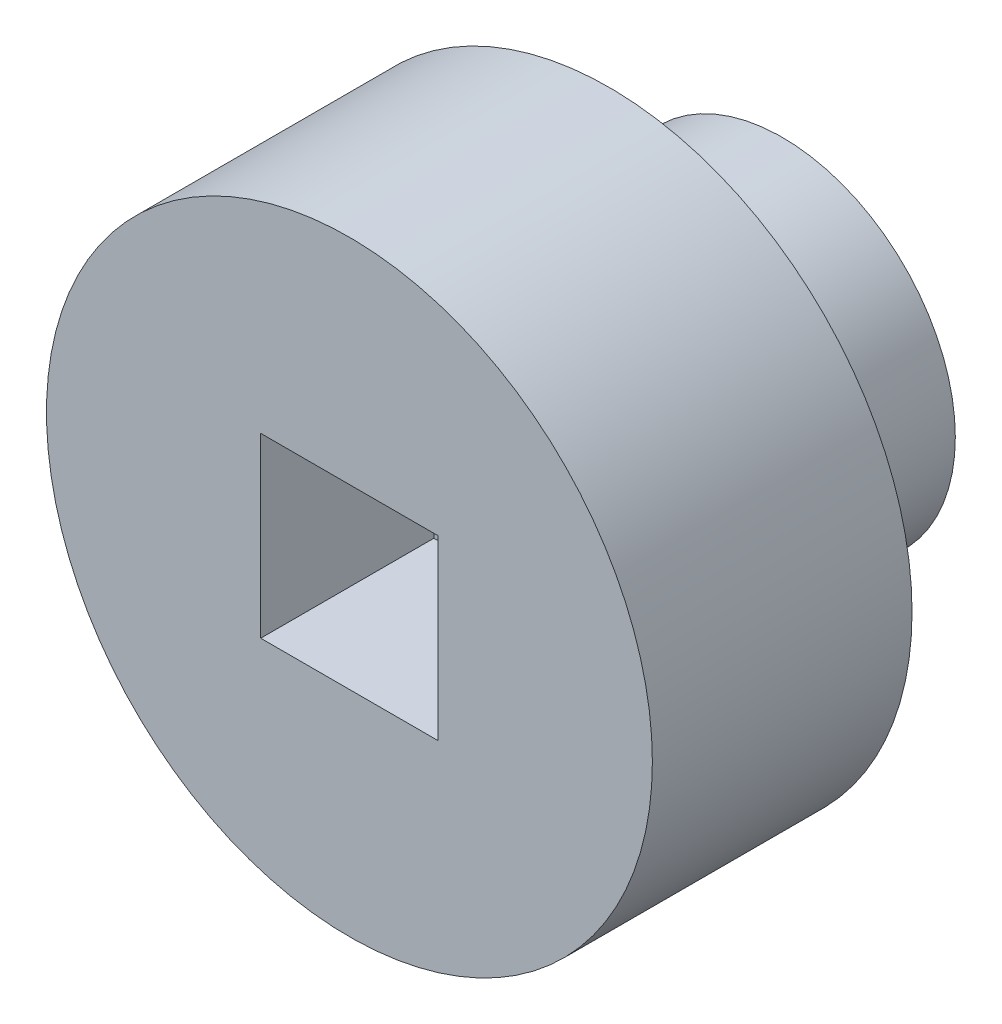
ISO-10303-21;
HEADER;
FILE_DESCRIPTION(('STEP AP214'),'2;1');
FILE_NAME('part.step','',(''),(''),'','','');
FILE_SCHEMA(('AUTOMOTIVE_DESIGN { 1 0 10303 214 1 1 1 1 }'));
ENDSEC;
DATA;
#1=APPLICATION_CONTEXT('core data for automotive mechanical design processes');
#2=APPLICATION_PROTOCOL_DEFINITION('international standard','automotive_design',2000,#1);
#3=PRODUCT_CONTEXT('',#1,'mechanical');
#4=PRODUCT('Part','Part','',(#3));
#5=PRODUCT_RELATED_PRODUCT_CATEGORY('part','',(#4));
#6=PRODUCT_DEFINITION_FORMATION('','',#4);
#7=PRODUCT_DEFINITION_CONTEXT('part definition',#1,'design');
#8=PRODUCT_DEFINITION('design','',#6,#7);
#9=PRODUCT_DEFINITION_SHAPE('','',#8);
#10=(LENGTH_UNIT() NAMED_UNIT(*) SI_UNIT(.MILLI.,.METRE.));
#11=(NAMED_UNIT(*) PLANE_ANGLE_UNIT() SI_UNIT($,.RADIAN.));
#12=(NAMED_UNIT(*) SI_UNIT($,.STERADIAN.) SOLID_ANGLE_UNIT());
#13=UNCERTAINTY_MEASURE_WITH_UNIT(LENGTH_MEASURE(1.E-05),#10,'distance_accuracy_value','');
#14=(GEOMETRIC_REPRESENTATION_CONTEXT(3) GLOBAL_UNCERTAINTY_ASSIGNED_CONTEXT((#13)) GLOBAL_UNIT_ASSIGNED_CONTEXT((#10,
#11,#12)) REPRESENTATION_CONTEXT('',''));
#15=CARTESIAN_POINT('',(0.,0.,0.));
#16=DIRECTION('',(0.,0.,1.));
#17=DIRECTION('',(1.,0.,0.));
#18=AXIS2_PLACEMENT_3D('',#15,#16,#17);
#19=CARTESIAN_POINT('',(-38.5953117709004,-1.19138897138363,30.6756320835275));
#20=DIRECTION('',(0.,0.,-1.));
#21=DIRECTION('',(-1.,0.,0.));
#22=AXIS2_PLACEMENT_3D('',#19,#20,#21);
#23=CYLINDRICAL_SURFACE('',#22,7.);
#24=CARTESIAN_POINT('',(-38.5953117709004,-1.19138897138363,21.1756320835275));
#25=DIRECTION('',(0.,0.,1.));
#26=DIRECTION('',(1.,0.,0.));
#27=AXIS2_PLACEMENT_3D('',#24,#25,#26);
#28=CIRCLE('',#27,7.);
#29=CARTESIAN_POINT('',(-31.5953117709004,-1.19138897138363,21.1756320835275));
#30=VERTEX_POINT('',#29);
#31=EDGE_CURVE('E86',#30,#30,#28,.T.);
#32=ORIENTED_EDGE('',*,*,#31,.T.);
#33=EDGE_LOOP('',(#32));
#34=FACE_BOUND('',#33,.T.);
#35=CARTESIAN_POINT('',(-38.5953117709004,-1.19138897138363,27.1756320835275));
#36=DIRECTION('',(0.,0.,1.));
#37=DIRECTION('',(1.,0.,0.));
#38=AXIS2_PLACEMENT_3D('',#35,#36,#37);
#39=CIRCLE('',#38,7.);
#40=CARTESIAN_POINT('',(-31.5953117709004,-1.19138897138363,27.1756320835275));
#41=VERTEX_POINT('',#40);
#42=EDGE_CURVE('E307',#41,#41,#39,.T.);
#43=ORIENTED_EDGE('',*,*,#42,.F.);
#44=EDGE_LOOP('',(#43));
#45=FACE_BOUND('',#44,.T.);
#46=ADVANCED_FACE('F79',(#34,#45),#23,.T.);
#47=CARTESIAN_POINT('',(-38.5953117709004,-1.19138897138363,17.1756320835275));
#48=DIRECTION('',(0.,0.,1.));
#49=DIRECTION('',(1.,0.,0.));
#50=AXIS2_PLACEMENT_3D('',#47,#48,#49);
#51=CYLINDRICAL_SURFACE('',#50,4.00000000000001);
#52=CARTESIAN_POINT('',(-38.5953117709004,-1.19138897138363,17.1756320835275));
#53=DIRECTION('',(0.,0.,1.));
#54=DIRECTION('',(1.,0.,0.));
#55=AXIS2_PLACEMENT_3D('',#52,#53,#54);
#56=CIRCLE('',#55,4.00000000000001);
#57=CARTESIAN_POINT('',(-34.5953117709004,-1.19138897138363,17.1756320835275));
#58=VERTEX_POINT('',#57);
#59=EDGE_CURVE('E146',#58,#58,#56,.T.);
#60=ORIENTED_EDGE('',*,*,#59,.T.);
#61=EDGE_LOOP('',(#60));
#62=FACE_BOUND('',#61,.T.);
#63=CARTESIAN_POINT('',(-38.5953117709004,-1.19138897138363,21.1756320835275));
#64=DIRECTION('',(0.,0.,1.));
#65=DIRECTION('',(1.,0.,0.));
#66=AXIS2_PLACEMENT_3D('',#63,#64,#65);
#67=CIRCLE('',#66,4.00000000000001);
#68=CARTESIAN_POINT('',(-34.5953117709004,-1.19138897138363,21.1756320835275));
#69=VERTEX_POINT('',#68);
#70=EDGE_CURVE('E152',#69,#69,#67,.T.);
#71=ORIENTED_EDGE('',*,*,#70,.F.);
#72=EDGE_LOOP('',(#71));
#73=FACE_BOUND('',#72,.T.);
#74=ADVANCED_FACE('F160',(#62,#73),#51,.T.);
#75=CARTESIAN_POINT('',(-38.5953117709004,-1.19138897138363,17.1756320835275));
#76=DIRECTION('',(0.,0.,1.));
#77=DIRECTION('',(1.,0.,0.));
#78=AXIS2_PLACEMENT_3D('',#75,#76,#77);
#79=PLANE('',#78);
#80=CARTESIAN_POINT('',(-38.5953117709004,-1.19138897138363,17.1756320835275));
#81=DIRECTION('',(0.,0.,-1.));
#82=DIRECTION('',(-1.,0.,0.));
#83=AXIS2_PLACEMENT_3D('',#80,#81,#82);
#84=CIRCLE('',#83,1.025);
#85=CARTESIAN_POINT('',(-39.6203117709004,-1.19138897138363,17.1756320835275));
#86=VERTEX_POINT('',#85);
#87=EDGE_CURVE('E147',#86,#86,#84,.T.);
#88=ORIENTED_EDGE('',*,*,#87,.F.);
#89=EDGE_LOOP('',(#88));
#90=FACE_BOUND('',#89,.T.);
#91=ORIENTED_EDGE('',*,*,#59,.F.);
#92=EDGE_LOOP('',(#91));
#93=FACE_BOUND('',#92,.T.);
#94=ADVANCED_FACE('F162',(#90,#93),#79,.F.);
#95=CARTESIAN_POINT('',(-38.5953117709004,-1.19138897138363,21.1756320835275));
#96=DIRECTION('',(0.,0.,1.));
#97=DIRECTION('',(1.,0.,0.));
#98=AXIS2_PLACEMENT_3D('',#95,#96,#97);
#99=PLANE('',#98);
#100=ORIENTED_EDGE('',*,*,#70,.T.);
#101=EDGE_LOOP('',(#100));
#102=FACE_BOUND('',#101,.T.);
#103=ORIENTED_EDGE('',*,*,#31,.F.);
#104=EDGE_LOOP('',(#103));
#105=FACE_BOUND('',#104,.T.);
#106=ADVANCED_FACE('F157',(#102,#105),#99,.F.);
#107=CARTESIAN_POINT('',(-38.5953117709004,-1.19138897138363,21.1756320835275));
#108=DIRECTION('',(0.,0.,-1.));
#109=DIRECTION('',(-1.,0.,0.));
#110=AXIS2_PLACEMENT_3D('',#107,#108,#109);
#111=CYLINDRICAL_SURFACE('',#110,1.025);
#112=CARTESIAN_POINT('',(-38.5953117709004,-1.19138897138363,21.1756320835275));
#113=DIRECTION('',(0.,0.,-1.));
#114=DIRECTION('',(-1.,0.,0.));
#115=AXIS2_PLACEMENT_3D('',#112,#113,#114);
#116=CIRCLE('',#115,1.025);
#117=CARTESIAN_POINT('',(-39.6203117709004,-1.19138897138363,21.1756320835275));
#118=VERTEX_POINT('',#117);
#119=EDGE_CURVE('E143',#118,#118,#116,.T.);
#120=ORIENTED_EDGE('',*,*,#119,.F.);
#121=EDGE_LOOP('',(#120));
#122=FACE_BOUND('',#121,.T.);
#123=ORIENTED_EDGE('',*,*,#87,.T.);
#124=EDGE_LOOP('',(#123));
#125=FACE_BOUND('',#124,.T.);
#126=ADVANCED_FACE('F174',(#122,#125),#111,.F.);
#127=CARTESIAN_POINT('',(-38.5953117709004,-1.19138897138363,21.1756320835275));
#128=DIRECTION('',(0.,0.,-1.));
#129=DIRECTION('',(-1.,0.,0.));
#130=AXIS2_PLACEMENT_3D('',#127,#128,#129);
#131=PLANE('',#130);
#132=ORIENTED_EDGE('',*,*,#119,.T.);
#133=EDGE_LOOP('',(#132));
#134=FACE_BOUND('',#133,.T.);
#135=ADVANCED_FACE('F178',(#134),#131,.T.);
#136=CARTESIAN_POINT('',(-38.5953117709004,-1.19138897138363,27.1756320835275));
#137=DIRECTION('',(0.,0.,1.));
#138=DIRECTION('',(1.,0.,0.));
#139=AXIS2_PLACEMENT_3D('',#136,#137,#138);
#140=PLANE('',#139);
#141=DIRECTION('',(-1.,0.,0.));
#142=VECTOR('',#141,1.);
#143=CARTESIAN_POINT('',(0.,-3.24138897138363,27.1756320835275));
#144=LINE('',#143,#142);
#145=CARTESIAN_POINT('',(-36.5453117709004,-3.24138897138363,27.1756320835275));
#146=VERTEX_POINT('',#145);
#147=CARTESIAN_POINT('',(-40.6453117709004,-3.24138897138363,27.1756320835275));
#148=VERTEX_POINT('',#147);
#149=EDGE_CURVE('E128',#146,#148,#144,.T.);
#150=ORIENTED_EDGE('',*,*,#149,.T.);
#151=DIRECTION('',(0.,1.,0.));
#152=VECTOR('',#151,1.);
#153=CARTESIAN_POINT('',(-40.6453117709004,0.,27.1756320835275));
#154=LINE('',#153,#152);
#155=CARTESIAN_POINT('',(-40.6453117709004,0.858611028616373,27.1756320835275));
#156=VERTEX_POINT('',#155);
#157=EDGE_CURVE('E93',#148,#156,#154,.T.);
#158=ORIENTED_EDGE('',*,*,#157,.T.);
#159=DIRECTION('',(-1.,0.,0.));
#160=VECTOR('',#159,1.);
#161=CARTESIAN_POINT('',(0.,0.858611028616373,27.1756320835275));
#162=LINE('',#161,#160);
#163=CARTESIAN_POINT('',(-36.5453117709004,0.858611028616373,27.1756320835275));
#164=VERTEX_POINT('',#163);
#165=EDGE_CURVE('E12',#164,#156,#162,.T.);
#166=ORIENTED_EDGE('',*,*,#165,.F.);
#167=DIRECTION('',(0.,1.,0.));
#168=VECTOR('',#167,1.);
#169=CARTESIAN_POINT('',(-36.5453117709004,0.,27.1756320835275));
#170=LINE('',#169,#168);
#171=EDGE_CURVE('E120',#146,#164,#170,.T.);
#172=ORIENTED_EDGE('',*,*,#171,.F.);
#173=EDGE_LOOP('',(#150,#158,#166,#172));
#174=FACE_BOUND('',#173,.T.);
#175=ORIENTED_EDGE('',*,*,#42,.T.);
#176=EDGE_LOOP('',(#175));
#177=FACE_BOUND('',#176,.T.);
#178=ADVANCED_FACE('F118',(#174,#177),#140,.T.);
#179=CARTESIAN_POINT('',(0.,0.,23.1756320835275));
#180=DIRECTION('',(0.,0.,1.));
#181=DIRECTION('',(1.,0.,0.));
#182=AXIS2_PLACEMENT_3D('',#179,#180,#181);
#183=PLANE('',#182);
#184=DIRECTION('',(0.,-1.,0.));
#185=VECTOR('',#184,1.);
#186=CARTESIAN_POINT('',(-36.5453117709004,0.,23.1756320835275));
#187=LINE('',#186,#185);
#188=CARTESIAN_POINT('',(-36.5453117709004,0.858611028616373,23.1756320835275));
#189=VERTEX_POINT('',#188);
#190=CARTESIAN_POINT('',(-36.5453117709004,-3.24138897138363,23.1756320835275));
#191=VERTEX_POINT('',#190);
#192=EDGE_CURVE('E100',#189,#191,#187,.T.);
#193=ORIENTED_EDGE('',*,*,#192,.F.);
#194=DIRECTION('',(1.,0.,0.));
#195=VECTOR('',#194,1.);
#196=CARTESIAN_POINT('',(0.,0.858611028616373,23.1756320835275));
#197=LINE('',#196,#195);
#198=CARTESIAN_POINT('',(-40.6453117709004,0.858611028616373,23.1756320835275));
#199=VERTEX_POINT('',#198);
#200=EDGE_CURVE('E132',#199,#189,#197,.T.);
#201=ORIENTED_EDGE('',*,*,#200,.F.);
#202=DIRECTION('',(0.,-1.,0.));
#203=VECTOR('',#202,1.);
#204=CARTESIAN_POINT('',(-40.6453117709004,0.,23.1756320835275));
#205=LINE('',#204,#203);
#206=CARTESIAN_POINT('',(-40.6453117709004,-3.24138897138363,23.1756320835275));
#207=VERTEX_POINT('',#206);
#208=EDGE_CURVE('E139',#199,#207,#205,.T.);
#209=ORIENTED_EDGE('',*,*,#208,.T.);
#210=DIRECTION('',(1.,0.,0.));
#211=VECTOR('',#210,1.);
#212=CARTESIAN_POINT('',(0.,-3.24138897138363,23.1756320835275));
#213=LINE('',#212,#211);
#214=EDGE_CURVE('E134',#207,#191,#213,.T.);
#215=ORIENTED_EDGE('',*,*,#214,.T.);
#216=EDGE_LOOP('',(#193,#201,#209,#215));
#217=FACE_BOUND('',#216,.T.);
#218=ADVANCED_FACE('F194',(#217),#183,.T.);
#219=CARTESIAN_POINT('',(0.,0.858611028616373,23.1756320835275));
#220=DIRECTION('',(0.,-1.,0.));
#221=DIRECTION('',(0.,0.,-1.));
#222=AXIS2_PLACEMENT_3D('',#219,#220,#221);
#223=PLANE('',#222);
#224=DIRECTION('',(0.,0.,1.));
#225=VECTOR('',#224,1.);
#226=CARTESIAN_POINT('',(-36.5453117709004,0.858611028616373,23.1756320835275));
#227=LINE('',#226,#225);
#228=EDGE_CURVE('E126',#189,#164,#227,.T.);
#229=ORIENTED_EDGE('',*,*,#228,.T.);
#230=ORIENTED_EDGE('',*,*,#165,.T.);
#231=DIRECTION('',(0.,0.,1.));
#232=VECTOR('',#231,1.);
#233=CARTESIAN_POINT('',(-40.6453117709004,0.858611028616373,23.1756320835275));
#234=LINE('',#233,#232);
#235=EDGE_CURVE('E133',#199,#156,#234,.T.);
#236=ORIENTED_EDGE('',*,*,#235,.F.);
#237=ORIENTED_EDGE('',*,*,#200,.T.);
#238=EDGE_LOOP('',(#229,#230,#236,#237));
#239=FACE_BOUND('',#238,.T.);
#240=ADVANCED_FACE('F130',(#239),#223,.T.);
#241=CARTESIAN_POINT('',(-40.6453117709004,0.,23.1756320835275));
#242=DIRECTION('',(-1.,0.,0.));
#243=DIRECTION('',(0.,0.,1.));
#244=AXIS2_PLACEMENT_3D('',#241,#242,#243);
#245=PLANE('',#244);
#246=ORIENTED_EDGE('',*,*,#157,.F.);
#247=DIRECTION('',(0.,0.,1.));
#248=VECTOR('',#247,1.);
#249=CARTESIAN_POINT('',(-40.6453117709004,-3.24138897138363,23.1756320835275));
#250=LINE('',#249,#248);
#251=EDGE_CURVE('E136',#207,#148,#250,.T.);
#252=ORIENTED_EDGE('',*,*,#251,.F.);
#253=ORIENTED_EDGE('',*,*,#208,.F.);
#254=ORIENTED_EDGE('',*,*,#235,.T.);
#255=EDGE_LOOP('',(#246,#252,#253,#254));
#256=FACE_BOUND('',#255,.T.);
#257=ADVANCED_FACE('F193',(#256),#245,.F.);
#258=CARTESIAN_POINT('',(0.,-3.24138897138363,23.1756320835275));
#259=DIRECTION('',(0.,-1.,0.));
#260=DIRECTION('',(0.,0.,-1.));
#261=AXIS2_PLACEMENT_3D('',#258,#259,#260);
#262=PLANE('',#261);
#263=ORIENTED_EDGE('',*,*,#149,.F.);
#264=DIRECTION('',(0.,0.,1.));
#265=VECTOR('',#264,1.);
#266=CARTESIAN_POINT('',(-36.5453117709004,-3.24138897138363,23.1756320835275));
#267=LINE('',#266,#265);
#268=EDGE_CURVE('E127',#191,#146,#267,.T.);
#269=ORIENTED_EDGE('',*,*,#268,.F.);
#270=ORIENTED_EDGE('',*,*,#214,.F.);
#271=ORIENTED_EDGE('',*,*,#251,.T.);
#272=EDGE_LOOP('',(#263,#269,#270,#271));
#273=FACE_BOUND('',#272,.T.);
#274=ADVANCED_FACE('F190',(#273),#262,.F.);
#275=CARTESIAN_POINT('',(-36.5453117709004,0.,23.1756320835275));
#276=DIRECTION('',(-1.,0.,0.));
#277=DIRECTION('',(0.,0.,1.));
#278=AXIS2_PLACEMENT_3D('',#275,#276,#277);
#279=PLANE('',#278);
#280=ORIENTED_EDGE('',*,*,#268,.T.);
#281=ORIENTED_EDGE('',*,*,#171,.T.);
#282=ORIENTED_EDGE('',*,*,#228,.F.);
#283=ORIENTED_EDGE('',*,*,#192,.T.);
#284=EDGE_LOOP('',(#280,#281,#282,#283));
#285=FACE_BOUND('',#284,.T.);
#286=ADVANCED_FACE('F125',(#285),#279,.T.);
#287=CLOSED_SHELL('',(#46,#74,#94,#106,#126,#135,#178,#218,#240,#257,#274,#286));
#288=MANIFOLD_SOLID_BREP('B2',#287);
#289=ADVANCED_BREP_SHAPE_REPRESENTATION('',(#18,#288),#14);
#290=SHAPE_DEFINITION_REPRESENTATION(#9,#289);
ENDSEC;
END-ISO-10303-21;
